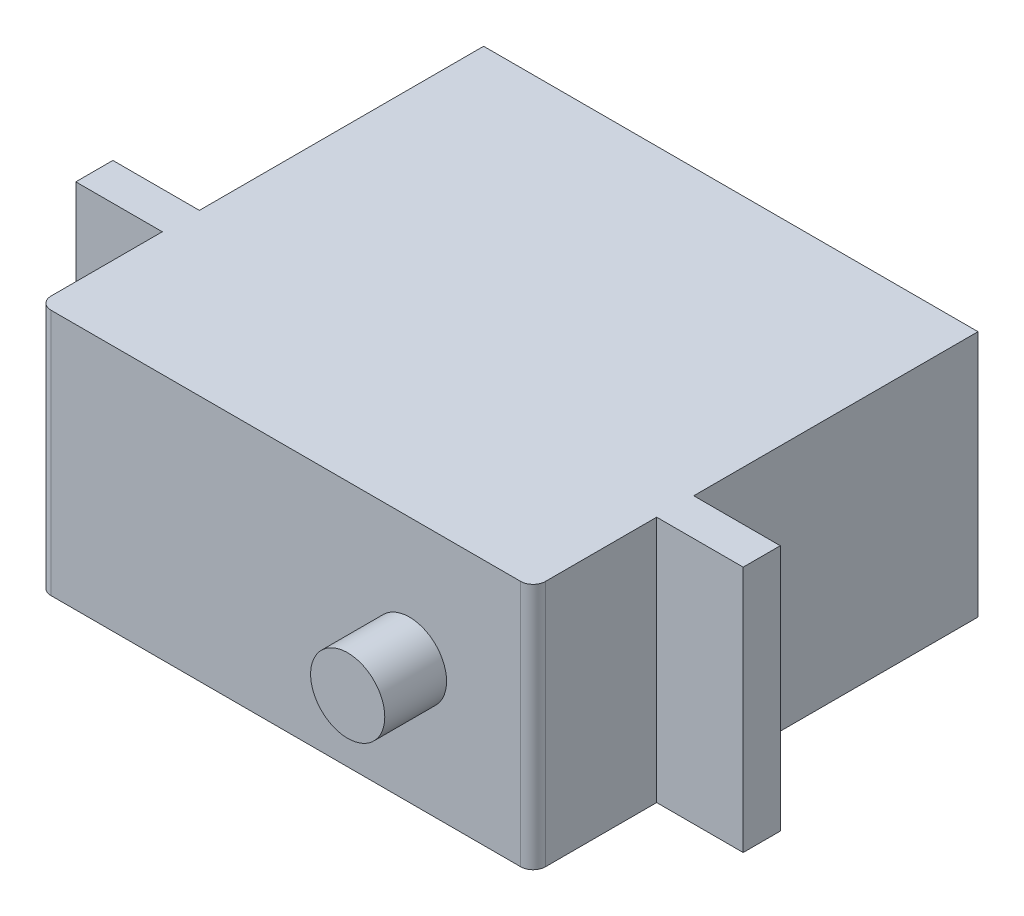
ISO-10303-21;
HEADER;
FILE_DESCRIPTION(('STEP AP214'),'2;1');
FILE_NAME('part.step','',(''),(''),'','','');
FILE_SCHEMA(('AUTOMOTIVE_DESIGN { 1 0 10303 214 1 1 1 1 }'));
ENDSEC;
DATA;
#1=APPLICATION_CONTEXT('core data for automotive mechanical design processes');
#2=APPLICATION_PROTOCOL_DEFINITION('international standard','automotive_design',2000,#1);
#3=PRODUCT_CONTEXT('',#1,'mechanical');
#4=PRODUCT('Part','Part','',(#3));
#5=PRODUCT_RELATED_PRODUCT_CATEGORY('part','',(#4));
#6=PRODUCT_DEFINITION_FORMATION('','',#4);
#7=PRODUCT_DEFINITION_CONTEXT('part definition',#1,'design');
#8=PRODUCT_DEFINITION('design','',#6,#7);
#9=PRODUCT_DEFINITION_SHAPE('','',#8);
#10=(LENGTH_UNIT() NAMED_UNIT(*) SI_UNIT(.MILLI.,.METRE.));
#11=(NAMED_UNIT(*) PLANE_ANGLE_UNIT() SI_UNIT($,.RADIAN.));
#12=(NAMED_UNIT(*) SI_UNIT($,.STERADIAN.) SOLID_ANGLE_UNIT());
#13=UNCERTAINTY_MEASURE_WITH_UNIT(LENGTH_MEASURE(1.E-05),#10,'distance_accuracy_value','');
#14=(GEOMETRIC_REPRESENTATION_CONTEXT(3) GLOBAL_UNCERTAINTY_ASSIGNED_CONTEXT((#13)) GLOBAL_UNIT_ASSIGNED_CONTEXT((#10,
#11,#12)) REPRESENTATION_CONTEXT('',''));
#15=CARTESIAN_POINT('',(0.,0.,0.));
#16=DIRECTION('',(0.,0.,1.));
#17=DIRECTION('',(1.,0.,0.));
#18=AXIS2_PLACEMENT_3D('',#15,#16,#17);
#19=CARTESIAN_POINT('',(-24.8860489621879,10.2906976744186,36.));
#20=DIRECTION('',(1.,0.,0.));
#21=DIRECTION('',(0.,1.,0.));
#22=AXIS2_PLACEMENT_3D('',#19,#20,#21);
#23=PLANE('',#22);
#24=DIRECTION('',(0.,0.,-1.));
#25=VECTOR('',#24,1.);
#26=CARTESIAN_POINT('',(-24.8860489621878,-9.70930232558139,36.));
#27=LINE('',#26,#25);
#28=CARTESIAN_POINT('',(-24.8860489621878,-9.70930232558139,35.));
#29=VERTEX_POINT('',#28);
#30=CARTESIAN_POINT('',(-24.8860489621878,-9.70930232558139,26.));
#31=VERTEX_POINT('',#30);
#32=EDGE_CURVE('E237',#29,#31,#27,.T.);
#33=ORIENTED_EDGE('',*,*,#32,.F.);
#34=DIRECTION('',(0.,-1.,0.));
#35=VECTOR('',#34,1.);
#36=CARTESIAN_POINT('',(-24.8860489621879,10.2906976744186,35.));
#37=LINE('',#36,#35);
#38=CARTESIAN_POINT('',(-24.8860489621879,10.2906976744186,35.));
#39=VERTEX_POINT('',#38);
#40=EDGE_CURVE('E11',#29,#39,#37,.F.);
#41=ORIENTED_EDGE('',*,*,#40,.T.);
#42=DIRECTION('',(0.,0.,-1.));
#43=VECTOR('',#42,1.);
#44=CARTESIAN_POINT('',(-24.8860489621879,10.2906976744186,36.));
#45=LINE('',#44,#43);
#46=CARTESIAN_POINT('',(-24.8860489621879,10.2906976744186,26.));
#47=VERTEX_POINT('',#46);
#48=EDGE_CURVE('E240',#39,#47,#45,.T.);
#49=ORIENTED_EDGE('',*,*,#48,.T.);
#50=DIRECTION('',(0.,1.,0.));
#51=VECTOR('',#50,1.);
#52=CARTESIAN_POINT('',(-24.8860489621879,10.2906976744186,26.));
#53=LINE('',#52,#51);
#54=EDGE_CURVE('E161',#31,#47,#53,.T.);
#55=ORIENTED_EDGE('',*,*,#54,.F.);
#56=EDGE_LOOP('',(#33,#41,#49,#55));
#57=FACE_BOUND('',#56,.T.);
#58=ADVANCED_FACE('F33',(#57),#23,.F.);
#59=DIRECTION('',(0.,-1.,0.));
#60=VECTOR('',#59,1.);
#61=CARTESIAN_POINT('',(-24.8860489621879,10.2906976744186,23.));
#62=LINE('',#61,#60);
#63=CARTESIAN_POINT('',(-24.8860489621879,10.2906976744186,23.));
#64=VERTEX_POINT('',#63);
#65=CARTESIAN_POINT('',(-24.8860489621878,-9.70930232558139,23.));
#66=VERTEX_POINT('',#65);
#67=EDGE_CURVE('E157',#64,#66,#62,.T.);
#68=ORIENTED_EDGE('',*,*,#67,.F.);
#69=CARTESIAN_POINT('',(-24.8860489621879,10.2906976744186,0.));
#70=VERTEX_POINT('',#69);
#71=EDGE_CURVE('E191',#64,#70,#45,.T.);
#72=ORIENTED_EDGE('',*,*,#71,.T.);
#73=DIRECTION('',(0.,-1.,0.));
#74=VECTOR('',#73,1.);
#75=CARTESIAN_POINT('',(-24.8860489621879,10.2906976744186,0.));
#76=LINE('',#75,#74);
#77=CARTESIAN_POINT('',(-24.8860489621878,-9.70930232558139,0.));
#78=VERTEX_POINT('',#77);
#79=EDGE_CURVE('E271',#70,#78,#76,.T.);
#80=ORIENTED_EDGE('',*,*,#79,.T.);
#81=EDGE_CURVE('E289',#66,#78,#27,.T.);
#82=ORIENTED_EDGE('',*,*,#81,.F.);
#83=EDGE_LOOP('',(#68,#72,#80,#82));
#84=FACE_BOUND('',#83,.T.);
#85=ADVANCED_FACE('F288',(#84),#23,.F.);
#86=CARTESIAN_POINT('',(15.1139510378122,10.2906976744186,36.));
#87=DIRECTION('',(-1.,0.,0.));
#88=DIRECTION('',(0.,0.,1.));
#89=AXIS2_PLACEMENT_3D('',#86,#87,#88);
#90=PLANE('',#89);
#91=DIRECTION('',(0.,0.,-1.));
#92=VECTOR('',#91,1.);
#93=CARTESIAN_POINT('',(15.1139510378122,10.2906976744186,36.));
#94=LINE('',#93,#92);
#95=CARTESIAN_POINT('',(15.1139510378122,10.2906976744186,35.));
#96=VERTEX_POINT('',#95);
#97=CARTESIAN_POINT('',(15.1139510378122,10.2906976744186,26.));
#98=VERTEX_POINT('',#97);
#99=EDGE_CURVE('E243',#96,#98,#94,.T.);
#100=ORIENTED_EDGE('',*,*,#99,.F.);
#101=DIRECTION('',(0.,1.,0.));
#102=VECTOR('',#101,1.);
#103=CARTESIAN_POINT('',(15.1139510378122,-9.70930232558139,35.));
#104=LINE('',#103,#102);
#105=CARTESIAN_POINT('',(15.1139510378122,-9.70930232558139,35.));
#106=VERTEX_POINT('',#105);
#107=EDGE_CURVE('E56',#96,#106,#104,.F.);
#108=ORIENTED_EDGE('',*,*,#107,.T.);
#109=DIRECTION('',(0.,0.,-1.));
#110=VECTOR('',#109,1.);
#111=CARTESIAN_POINT('',(15.1139510378122,-9.70930232558139,36.));
#112=LINE('',#111,#110);
#113=CARTESIAN_POINT('',(15.1139510378122,-9.70930232558139,26.));
#114=VERTEX_POINT('',#113);
#115=EDGE_CURVE('E259',#106,#114,#112,.T.);
#116=ORIENTED_EDGE('',*,*,#115,.T.);
#117=DIRECTION('',(0.,-1.,0.));
#118=VECTOR('',#117,1.);
#119=CARTESIAN_POINT('',(15.1139510378122,10.2906976744186,26.));
#120=LINE('',#119,#118);
#121=EDGE_CURVE('E162',#98,#114,#120,.T.);
#122=ORIENTED_EDGE('',*,*,#121,.F.);
#123=EDGE_LOOP('',(#100,#108,#116,#122));
#124=FACE_BOUND('',#123,.T.);
#125=ADVANCED_FACE('F304',(#124),#90,.F.);
#126=DIRECTION('',(0.,1.,0.));
#127=VECTOR('',#126,1.);
#128=CARTESIAN_POINT('',(15.1139510378122,10.2906976744186,23.));
#129=LINE('',#128,#127);
#130=CARTESIAN_POINT('',(15.1139510378122,-9.70930232558139,23.));
#131=VERTEX_POINT('',#130);
#132=CARTESIAN_POINT('',(15.1139510378122,10.2906976744186,23.));
#133=VERTEX_POINT('',#132);
#134=EDGE_CURVE('E165',#131,#133,#129,.T.);
#135=ORIENTED_EDGE('',*,*,#134,.F.);
#136=CARTESIAN_POINT('',(15.1139510378122,-9.70930232558139,0.));
#137=VERTEX_POINT('',#136);
#138=EDGE_CURVE('E257',#131,#137,#112,.T.);
#139=ORIENTED_EDGE('',*,*,#138,.T.);
#140=DIRECTION('',(0.,1.,0.));
#141=VECTOR('',#140,1.);
#142=CARTESIAN_POINT('',(15.1139510378122,10.2906976744186,0.));
#143=LINE('',#142,#141);
#144=CARTESIAN_POINT('',(15.1139510378122,10.2906976744186,0.));
#145=VERTEX_POINT('',#144);
#146=EDGE_CURVE('E277',#137,#145,#143,.T.);
#147=ORIENTED_EDGE('',*,*,#146,.T.);
#148=EDGE_CURVE('E242',#133,#145,#94,.T.);
#149=ORIENTED_EDGE('',*,*,#148,.F.);
#150=EDGE_LOOP('',(#135,#139,#147,#149));
#151=FACE_BOUND('',#150,.T.);
#152=ADVANCED_FACE('F397',(#151),#90,.F.);
#153=CARTESIAN_POINT('',(-24.8860489621878,-9.70930232558139,36.));
#154=DIRECTION('',(0.,1.,0.));
#155=DIRECTION('',(0.,0.,1.));
#156=AXIS2_PLACEMENT_3D('',#153,#154,#155);
#157=PLANE('',#156);
#158=ORIENTED_EDGE('',*,*,#115,.F.);
#159=CARTESIAN_POINT('',(14.1139510378122,-9.70930232558139,35.));
#160=DIRECTION('',(0.,1.,0.));
#161=DIRECTION('',(0.,0.,1.));
#162=AXIS2_PLACEMENT_3D('',#159,#160,#161);
#163=CIRCLE('',#162,1.);
#164=CARTESIAN_POINT('',(14.1139510378121,-9.70930232558139,36.));
#165=VERTEX_POINT('',#164);
#166=EDGE_CURVE('E41',#106,#165,#163,.F.);
#167=ORIENTED_EDGE('',*,*,#166,.T.);
#168=DIRECTION('',(1.,0.,0.));
#169=VECTOR('',#168,1.);
#170=CARTESIAN_POINT('',(-24.8860489621878,-9.70930232558139,36.));
#171=LINE('',#170,#169);
#172=CARTESIAN_POINT('',(-23.8860489621878,-9.70930232558139,36.));
#173=VERTEX_POINT('',#172);
#174=EDGE_CURVE('E221',#173,#165,#171,.T.);
#175=ORIENTED_EDGE('',*,*,#174,.F.);
#176=CARTESIAN_POINT('',(-23.8860489621878,-9.70930232558139,35.));
#177=DIRECTION('',(0.,1.,0.));
#178=DIRECTION('',(0.,0.,1.));
#179=AXIS2_PLACEMENT_3D('',#176,#177,#178);
#180=CIRCLE('',#179,1.);
#181=EDGE_CURVE('E48',#173,#29,#180,.F.);
#182=ORIENTED_EDGE('',*,*,#181,.T.);
#183=ORIENTED_EDGE('',*,*,#32,.T.);
#184=DIRECTION('',(1.,0.,0.));
#185=VECTOR('',#184,1.);
#186=CARTESIAN_POINT('',(-31.8860489621878,-9.7093023255814,26.));
#187=LINE('',#186,#185);
#188=CARTESIAN_POINT('',(-31.8860489621878,-9.7093023255814,26.));
#189=VERTEX_POINT('',#188);
#190=EDGE_CURVE('E177',#189,#31,#187,.T.);
#191=ORIENTED_EDGE('',*,*,#190,.F.);
#192=DIRECTION('',(0.,0.,1.));
#193=VECTOR('',#192,1.);
#194=CARTESIAN_POINT('',(-31.8860489621878,-9.7093023255814,26.));
#195=LINE('',#194,#193);
#196=CARTESIAN_POINT('',(-31.8860489621878,-9.7093023255814,23.));
#197=VERTEX_POINT('',#196);
#198=EDGE_CURVE('E153',#197,#189,#195,.T.);
#199=ORIENTED_EDGE('',*,*,#198,.F.);
#200=DIRECTION('',(1.,0.,0.));
#201=VECTOR('',#200,1.);
#202=CARTESIAN_POINT('',(-31.8860489621878,-9.7093023255814,23.));
#203=LINE('',#202,#201);
#204=EDGE_CURVE('E167',#197,#66,#203,.T.);
#205=ORIENTED_EDGE('',*,*,#204,.T.);
#206=ORIENTED_EDGE('',*,*,#81,.T.);
#207=DIRECTION('',(1.,0.,0.));
#208=VECTOR('',#207,1.);
#209=CARTESIAN_POINT('',(-24.8860489621878,-9.70930232558139,0.));
#210=LINE('',#209,#208);
#211=EDGE_CURVE('E274',#78,#137,#210,.T.);
#212=ORIENTED_EDGE('',*,*,#211,.T.);
#213=ORIENTED_EDGE('',*,*,#138,.F.);
#214=DIRECTION('',(-1.,0.,0.));
#215=VECTOR('',#214,1.);
#216=CARTESIAN_POINT('',(22.1139510378122,-9.70930232558139,23.));
#217=LINE('',#216,#215);
#218=CARTESIAN_POINT('',(22.1139510378122,-9.70930232558139,23.));
#219=VERTEX_POINT('',#218);
#220=EDGE_CURVE('E316',#219,#131,#217,.T.);
#221=ORIENTED_EDGE('',*,*,#220,.F.);
#222=DIRECTION('',(0.,0.,-1.));
#223=VECTOR('',#222,1.);
#224=CARTESIAN_POINT('',(22.1139510378122,-9.70930232558139,26.));
#225=LINE('',#224,#223);
#226=CARTESIAN_POINT('',(22.1139510378122,-9.70930232558139,26.));
#227=VERTEX_POINT('',#226);
#228=EDGE_CURVE('E334',#227,#219,#225,.T.);
#229=ORIENTED_EDGE('',*,*,#228,.F.);
#230=DIRECTION('',(-1.,0.,0.));
#231=VECTOR('',#230,1.);
#232=CARTESIAN_POINT('',(22.1139510378122,-9.70930232558139,26.));
#233=LINE('',#232,#231);
#234=EDGE_CURVE('E275',#227,#114,#233,.T.);
#235=ORIENTED_EDGE('',*,*,#234,.T.);
#236=EDGE_LOOP('',(#158,#167,#175,#182,#183,#191,#199,#205,#206,#212,#213,#221,#229,#235));
#237=FACE_BOUND('',#236,.T.);
#238=ADVANCED_FACE('F292',(#237),#157,.F.);
#239=CARTESIAN_POINT('',(-24.8860489621879,10.2906976744186,36.));
#240=DIRECTION('',(0.,-1.,0.));
#241=DIRECTION('',(0.,0.,-1.));
#242=AXIS2_PLACEMENT_3D('',#239,#240,#241);
#243=PLANE('',#242);
#244=DIRECTION('',(-1.,0.,0.));
#245=VECTOR('',#244,1.);
#246=CARTESIAN_POINT('',(-24.8860489621879,10.2906976744186,36.));
#247=LINE('',#246,#245);
#248=CARTESIAN_POINT('',(14.1139510378122,10.2906976744186,36.));
#249=VERTEX_POINT('',#248);
#250=CARTESIAN_POINT('',(-23.8860489621879,10.2906976744186,36.));
#251=VERTEX_POINT('',#250);
#252=EDGE_CURVE('E227',#249,#251,#247,.T.);
#253=ORIENTED_EDGE('',*,*,#252,.F.);
#254=CARTESIAN_POINT('',(14.1139510378122,10.2906976744186,35.));
#255=DIRECTION('',(0.,-1.,0.));
#256=DIRECTION('',(0.,0.,-1.));
#257=AXIS2_PLACEMENT_3D('',#254,#255,#256);
#258=CIRCLE('',#257,1.);
#259=EDGE_CURVE('E233',#249,#96,#258,.F.);
#260=ORIENTED_EDGE('',*,*,#259,.T.);
#261=ORIENTED_EDGE('',*,*,#99,.T.);
#262=DIRECTION('',(-1.,0.,0.));
#263=VECTOR('',#262,1.);
#264=CARTESIAN_POINT('',(22.1139510378122,10.2906976744186,26.));
#265=LINE('',#264,#263);
#266=CARTESIAN_POINT('',(22.1139510378122,10.2906976744186,26.));
#267=VERTEX_POINT('',#266);
#268=EDGE_CURVE('E310',#267,#98,#265,.T.);
#269=ORIENTED_EDGE('',*,*,#268,.F.);
#270=DIRECTION('',(0.,0.,1.));
#271=VECTOR('',#270,1.);
#272=CARTESIAN_POINT('',(22.1139510378122,10.2906976744186,26.));
#273=LINE('',#272,#271);
#274=CARTESIAN_POINT('',(22.1139510378122,10.2906976744186,23.));
#275=VERTEX_POINT('',#274);
#276=EDGE_CURVE('E314',#275,#267,#273,.T.);
#277=ORIENTED_EDGE('',*,*,#276,.F.);
#278=DIRECTION('',(-1.,0.,0.));
#279=VECTOR('',#278,1.);
#280=CARTESIAN_POINT('',(22.1139510378122,10.2906976744186,23.));
#281=LINE('',#280,#279);
#282=EDGE_CURVE('E263',#275,#133,#281,.T.);
#283=ORIENTED_EDGE('',*,*,#282,.T.);
#284=ORIENTED_EDGE('',*,*,#148,.T.);
#285=DIRECTION('',(-1.,0.,0.));
#286=VECTOR('',#285,1.);
#287=CARTESIAN_POINT('',(-24.8860489621879,10.2906976744186,0.));
#288=LINE('',#287,#286);
#289=EDGE_CURVE('E228',#145,#70,#288,.T.);
#290=ORIENTED_EDGE('',*,*,#289,.T.);
#291=ORIENTED_EDGE('',*,*,#71,.F.);
#292=DIRECTION('',(1.,0.,0.));
#293=VECTOR('',#292,1.);
#294=CARTESIAN_POINT('',(-31.8860489621879,10.2906976744186,23.));
#295=LINE('',#294,#293);
#296=CARTESIAN_POINT('',(-31.8860489621879,10.2906976744186,23.));
#297=VERTEX_POINT('',#296);
#298=EDGE_CURVE('E144',#297,#64,#295,.T.);
#299=ORIENTED_EDGE('',*,*,#298,.F.);
#300=DIRECTION('',(0.,0.,-1.));
#301=VECTOR('',#300,1.);
#302=CARTESIAN_POINT('',(-31.8860489621879,10.2906976744186,26.));
#303=LINE('',#302,#301);
#304=CARTESIAN_POINT('',(-31.8860489621879,10.2906976744186,26.));
#305=VERTEX_POINT('',#304);
#306=EDGE_CURVE('E134',#305,#297,#303,.T.);
#307=ORIENTED_EDGE('',*,*,#306,.F.);
#308=DIRECTION('',(1.,0.,0.));
#309=VECTOR('',#308,1.);
#310=CARTESIAN_POINT('',(-31.8860489621879,10.2906976744186,26.));
#311=LINE('',#310,#309);
#312=EDGE_CURVE('E140',#305,#47,#311,.T.);
#313=ORIENTED_EDGE('',*,*,#312,.T.);
#314=ORIENTED_EDGE('',*,*,#48,.F.);
#315=CARTESIAN_POINT('',(-23.8860489621879,10.2906976744186,35.));
#316=DIRECTION('',(0.,-1.,0.));
#317=DIRECTION('',(0.,0.,-1.));
#318=AXIS2_PLACEMENT_3D('',#315,#316,#317);
#319=CIRCLE('',#318,1.);
#320=EDGE_CURVE('E234',#39,#251,#319,.F.);
#321=ORIENTED_EDGE('',*,*,#320,.T.);
#322=EDGE_LOOP('',(#253,#260,#261,#269,#277,#283,#284,#290,#291,#299,#307,#313,#314,#321));
#323=FACE_BOUND('',#322,.T.);
#324=ADVANCED_FACE('F137',(#323),#243,.F.);
#325=CARTESIAN_POINT('',(0.,0.,36.));
#326=DIRECTION('',(0.,0.,1.));
#327=DIRECTION('',(1.,0.,0.));
#328=AXIS2_PLACEMENT_3D('',#325,#326,#327);
#329=PLANE('',#328);
#330=CARTESIAN_POINT('',(5.11395103781215,0.290697674418606,36.));
#331=DIRECTION('',(0.,0.,1.));
#332=DIRECTION('',(1.,0.,0.));
#333=AXIS2_PLACEMENT_3D('',#330,#331,#332);
#334=CIRCLE('',#333,3.);
#335=CARTESIAN_POINT('',(8.11395103781215,0.290697674418606,36.));
#336=VERTEX_POINT('',#335);
#337=EDGE_CURVE('E199',#336,#336,#334,.T.);
#338=ORIENTED_EDGE('',*,*,#337,.F.);
#339=EDGE_LOOP('',(#338));
#340=FACE_BOUND('',#339,.T.);
#341=ORIENTED_EDGE('',*,*,#174,.T.);
#342=DIRECTION('',(0.,1.,0.));
#343=VECTOR('',#342,1.);
#344=CARTESIAN_POINT('',(14.1139510378122,10.2906976744186,36.));
#345=LINE('',#344,#343);
#346=EDGE_CURVE('E224',#165,#249,#345,.T.);
#347=ORIENTED_EDGE('',*,*,#346,.T.);
#348=ORIENTED_EDGE('',*,*,#252,.T.);
#349=DIRECTION('',(0.,-1.,0.));
#350=VECTOR('',#349,1.);
#351=CARTESIAN_POINT('',(-23.8860489621878,-9.70930232558139,36.));
#352=LINE('',#351,#350);
#353=EDGE_CURVE('E226',#251,#173,#352,.T.);
#354=ORIENTED_EDGE('',*,*,#353,.T.);
#355=EDGE_LOOP('',(#341,#347,#348,#354));
#356=FACE_BOUND('',#355,.T.);
#357=ADVANCED_FACE('F213',(#340,#356),#329,.T.);
#358=CARTESIAN_POINT('',(0.,0.,0.));
#359=DIRECTION('',(0.,0.,1.));
#360=DIRECTION('',(1.,0.,0.));
#361=AXIS2_PLACEMENT_3D('',#358,#359,#360);
#362=PLANE('',#361);
#363=ORIENTED_EDGE('',*,*,#79,.F.);
#364=ORIENTED_EDGE('',*,*,#289,.F.);
#365=ORIENTED_EDGE('',*,*,#146,.F.);
#366=ORIENTED_EDGE('',*,*,#211,.F.);
#367=EDGE_LOOP('',(#363,#364,#365,#366));
#368=FACE_BOUND('',#367,.T.);
#369=ADVANCED_FACE('F216',(#368),#362,.F.);
#370=CARTESIAN_POINT('',(22.1139510378122,10.2906976744186,26.));
#371=DIRECTION('',(0.,0.,-1.));
#372=DIRECTION('',(0.,1.,0.));
#373=AXIS2_PLACEMENT_3D('',#370,#371,#372);
#374=PLANE('',#373);
#375=ORIENTED_EDGE('',*,*,#121,.T.);
#376=ORIENTED_EDGE('',*,*,#234,.F.);
#377=DIRECTION('',(0.,-1.,0.));
#378=VECTOR('',#377,1.);
#379=CARTESIAN_POINT('',(22.1139510378122,10.2906976744186,26.));
#380=LINE('',#379,#378);
#381=EDGE_CURVE('E185',#267,#227,#380,.T.);
#382=ORIENTED_EDGE('',*,*,#381,.F.);
#383=ORIENTED_EDGE('',*,*,#268,.T.);
#384=EDGE_LOOP('',(#375,#376,#382,#383));
#385=FACE_BOUND('',#384,.T.);
#386=ADVANCED_FACE('F311',(#385),#374,.F.);
#387=CARTESIAN_POINT('',(22.1139510378122,10.2906976744186,23.));
#388=DIRECTION('',(0.,0.,1.));
#389=DIRECTION('',(0.,-1.,0.));
#390=AXIS2_PLACEMENT_3D('',#387,#388,#389);
#391=PLANE('',#390);
#392=ORIENTED_EDGE('',*,*,#134,.T.);
#393=ORIENTED_EDGE('',*,*,#282,.F.);
#394=DIRECTION('',(0.,1.,0.));
#395=VECTOR('',#394,1.);
#396=CARTESIAN_POINT('',(22.1139510378122,10.2906976744186,23.));
#397=LINE('',#396,#395);
#398=EDGE_CURVE('E317',#219,#275,#397,.T.);
#399=ORIENTED_EDGE('',*,*,#398,.F.);
#400=ORIENTED_EDGE('',*,*,#220,.T.);
#401=EDGE_LOOP('',(#392,#393,#399,#400));
#402=FACE_BOUND('',#401,.T.);
#403=ADVANCED_FACE('F326',(#402),#391,.F.);
#404=CARTESIAN_POINT('',(22.1139510378122,0.,0.));
#405=DIRECTION('',(1.,0.,0.));
#406=DIRECTION('',(0.,0.,-1.));
#407=AXIS2_PLACEMENT_3D('',#404,#405,#406);
#408=PLANE('',#407);
#409=ORIENTED_EDGE('',*,*,#381,.T.);
#410=ORIENTED_EDGE('',*,*,#228,.T.);
#411=ORIENTED_EDGE('',*,*,#398,.T.);
#412=ORIENTED_EDGE('',*,*,#276,.T.);
#413=EDGE_LOOP('',(#409,#410,#411,#412));
#414=FACE_BOUND('',#413,.T.);
#415=ADVANCED_FACE('F336',(#414),#408,.T.);
#416=CARTESIAN_POINT('',(-31.8860489621879,10.2906976744186,26.));
#417=DIRECTION('',(0.,0.,-1.));
#418=DIRECTION('',(0.,1.,0.));
#419=AXIS2_PLACEMENT_3D('',#416,#417,#418);
#420=PLANE('',#419);
#421=ORIENTED_EDGE('',*,*,#54,.T.);
#422=ORIENTED_EDGE('',*,*,#312,.F.);
#423=DIRECTION('',(0.,1.,0.));
#424=VECTOR('',#423,1.);
#425=CARTESIAN_POINT('',(-31.8860489621879,10.2906976744186,26.));
#426=LINE('',#425,#424);
#427=EDGE_CURVE('E148',#189,#305,#426,.T.);
#428=ORIENTED_EDGE('',*,*,#427,.F.);
#429=ORIENTED_EDGE('',*,*,#190,.T.);
#430=EDGE_LOOP('',(#421,#422,#428,#429));
#431=FACE_BOUND('',#430,.T.);
#432=ADVANCED_FACE('F159',(#431),#420,.F.);
#433=CARTESIAN_POINT('',(-31.8860489621879,10.2906976744186,23.));
#434=DIRECTION('',(0.,0.,1.));
#435=DIRECTION('',(0.,-1.,0.));
#436=AXIS2_PLACEMENT_3D('',#433,#434,#435);
#437=PLANE('',#436);
#438=ORIENTED_EDGE('',*,*,#67,.T.);
#439=ORIENTED_EDGE('',*,*,#204,.F.);
#440=DIRECTION('',(0.,-1.,0.));
#441=VECTOR('',#440,1.);
#442=CARTESIAN_POINT('',(-31.8860489621879,10.2906976744186,23.));
#443=LINE('',#442,#441);
#444=EDGE_CURVE('E147',#297,#197,#443,.T.);
#445=ORIENTED_EDGE('',*,*,#444,.F.);
#446=ORIENTED_EDGE('',*,*,#298,.T.);
#447=EDGE_LOOP('',(#438,#439,#445,#446));
#448=FACE_BOUND('',#447,.T.);
#449=ADVANCED_FACE('F291',(#448),#437,.F.);
#450=CARTESIAN_POINT('',(-31.8860489621879,0.,0.));
#451=DIRECTION('',(1.,0.,0.));
#452=DIRECTION('',(0.,1.,0.));
#453=AXIS2_PLACEMENT_3D('',#450,#451,#452);
#454=PLANE('',#453);
#455=ORIENTED_EDGE('',*,*,#427,.T.);
#456=ORIENTED_EDGE('',*,*,#306,.T.);
#457=ORIENTED_EDGE('',*,*,#444,.T.);
#458=ORIENTED_EDGE('',*,*,#198,.T.);
#459=EDGE_LOOP('',(#455,#456,#457,#458));
#460=FACE_BOUND('',#459,.T.);
#461=ADVANCED_FACE('F151',(#460),#454,.F.);
#462=CARTESIAN_POINT('',(5.11395103781215,0.290697674418606,41.));
#463=DIRECTION('',(0.,0.,-1.));
#464=DIRECTION('',(-1.,0.,0.));
#465=AXIS2_PLACEMENT_3D('',#462,#463,#464);
#466=CYLINDRICAL_SURFACE('',#465,3.);
#467=CARTESIAN_POINT('',(5.11395103781215,0.290697674418606,41.));
#468=DIRECTION('',(0.,0.,1.));
#469=DIRECTION('',(1.,0.,0.));
#470=AXIS2_PLACEMENT_3D('',#467,#468,#469);
#471=CIRCLE('',#470,3.);
#472=CARTESIAN_POINT('',(8.11395103781215,0.290697674418606,41.));
#473=VERTEX_POINT('',#472);
#474=EDGE_CURVE('E176',#473,#473,#471,.T.);
#475=ORIENTED_EDGE('',*,*,#474,.F.);
#476=EDGE_LOOP('',(#475));
#477=FACE_BOUND('',#476,.T.);
#478=ORIENTED_EDGE('',*,*,#337,.T.);
#479=EDGE_LOOP('',(#478));
#480=FACE_BOUND('',#479,.T.);
#481=ADVANCED_FACE('F207',(#477,#480),#466,.T.);
#482=CARTESIAN_POINT('',(5.11395103781215,0.290697674418606,41.));
#483=DIRECTION('',(0.,0.,1.));
#484=DIRECTION('',(1.,0.,0.));
#485=AXIS2_PLACEMENT_3D('',#482,#483,#484);
#486=PLANE('',#485);
#487=ORIENTED_EDGE('',*,*,#474,.T.);
#488=EDGE_LOOP('',(#487));
#489=FACE_BOUND('',#488,.T.);
#490=ADVANCED_FACE('F205',(#489),#486,.T.);
#491=CARTESIAN_POINT('',(14.1139510378122,0.,35.));
#492=DIRECTION('',(0.,-1.,0.));
#493=DIRECTION('',(0.,0.,-1.));
#494=AXIS2_PLACEMENT_3D('',#491,#492,#493);
#495=CYLINDRICAL_SURFACE('',#494,1.);
#496=ORIENTED_EDGE('',*,*,#166,.F.);
#497=ORIENTED_EDGE('',*,*,#107,.F.);
#498=ORIENTED_EDGE('',*,*,#259,.F.);
#499=ORIENTED_EDGE('',*,*,#346,.F.);
#500=EDGE_LOOP('',(#496,#497,#498,#499));
#501=FACE_BOUND('',#500,.T.);
#502=ADVANCED_FACE('F232',(#501),#495,.T.);
#503=CARTESIAN_POINT('',(-23.8860489621878,0.,35.));
#504=DIRECTION('',(0.,1.,0.));
#505=DIRECTION('',(-1.,0.,0.));
#506=AXIS2_PLACEMENT_3D('',#503,#504,#505);
#507=CYLINDRICAL_SURFACE('',#506,1.);
#508=ORIENTED_EDGE('',*,*,#320,.F.);
#509=ORIENTED_EDGE('',*,*,#40,.F.);
#510=ORIENTED_EDGE('',*,*,#181,.F.);
#511=ORIENTED_EDGE('',*,*,#353,.F.);
#512=EDGE_LOOP('',(#508,#509,#510,#511));
#513=FACE_BOUND('',#512,.T.);
#514=ADVANCED_FACE('F35',(#513),#507,.T.);
#515=CLOSED_SHELL('',(#58,#85,#125,#152,#238,#324,#357,#369,#386,#403,#415,#432,#449,#461,#481,
#490,#502,#514));
#516=MANIFOLD_SOLID_BREP('B2',#515);
#517=ADVANCED_BREP_SHAPE_REPRESENTATION('',(#18,#516),#14);
#518=SHAPE_DEFINITION_REPRESENTATION(#9,#517);
ENDSEC;
END-ISO-10303-21;
